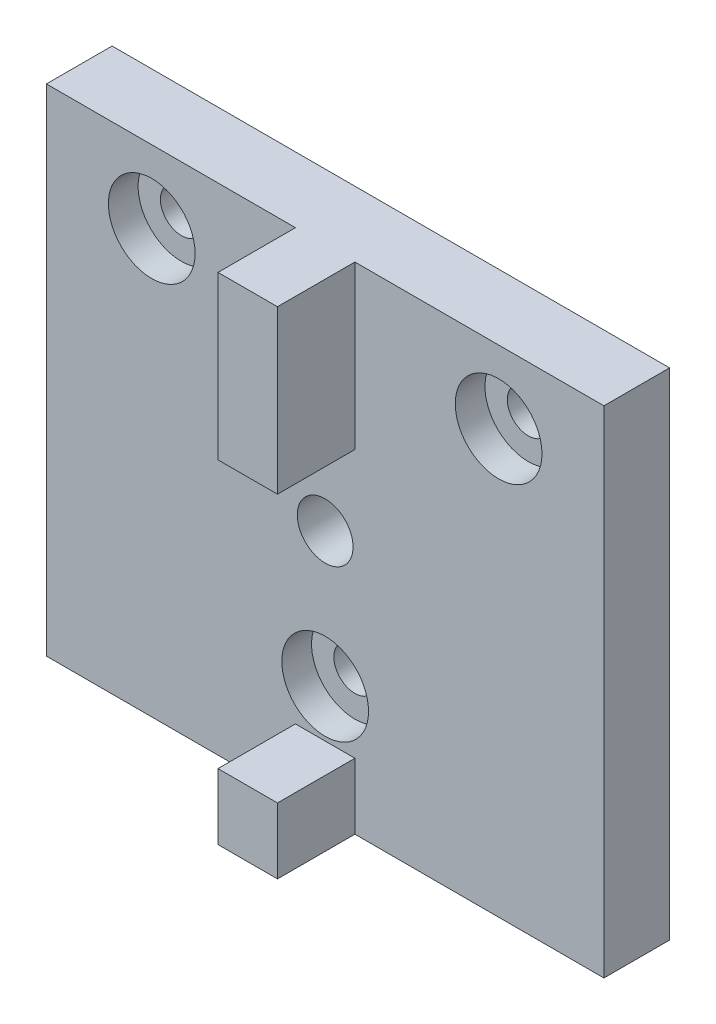
ISO-10303-21;
HEADER;
FILE_DESCRIPTION(('STEP AP214'),'2;1');
FILE_NAME('part.step','',(''),(''),'','','');
FILE_SCHEMA(('AUTOMOTIVE_DESIGN { 1 0 10303 214 1 1 1 1 }'));
ENDSEC;
DATA;
#1=APPLICATION_CONTEXT('core data for automotive mechanical design processes');
#2=APPLICATION_PROTOCOL_DEFINITION('international standard','automotive_design',2000,#1);
#3=PRODUCT_CONTEXT('',#1,'mechanical');
#4=PRODUCT('Part','Part','',(#3));
#5=PRODUCT_RELATED_PRODUCT_CATEGORY('part','',(#4));
#6=PRODUCT_DEFINITION_FORMATION('','',#4);
#7=PRODUCT_DEFINITION_CONTEXT('part definition',#1,'design');
#8=PRODUCT_DEFINITION('design','',#6,#7);
#9=PRODUCT_DEFINITION_SHAPE('','',#8);
#10=(LENGTH_UNIT() NAMED_UNIT(*) SI_UNIT(.MILLI.,.METRE.));
#11=(NAMED_UNIT(*) PLANE_ANGLE_UNIT() SI_UNIT($,.RADIAN.));
#12=(NAMED_UNIT(*) SI_UNIT($,.STERADIAN.) SOLID_ANGLE_UNIT());
#13=UNCERTAINTY_MEASURE_WITH_UNIT(LENGTH_MEASURE(1.E-05),#10,'distance_accuracy_value','');
#14=(GEOMETRIC_REPRESENTATION_CONTEXT(3) GLOBAL_UNCERTAINTY_ASSIGNED_CONTEXT((#13)) GLOBAL_UNIT_ASSIGNED_CONTEXT((#10,
#11,#12)) REPRESENTATION_CONTEXT('',''));
#15=CARTESIAN_POINT('',(0.,0.,0.));
#16=DIRECTION('',(0.,0.,1.));
#17=DIRECTION('',(1.,0.,0.));
#18=AXIS2_PLACEMENT_3D('',#15,#16,#17);
#19=CARTESIAN_POINT('',(3.,20.,-10.0617308618267));
#20=DIRECTION('',(0.,0.,-1.));
#21=DIRECTION('',(-1.,0.,0.));
#22=AXIS2_PLACEMENT_3D('',#19,#20,#21);
#23=PLANE('',#22);
#24=CARTESIAN_POINT('',(0.,0.,-10.0617308618267));
#25=DIRECTION('',(0.,0.,-1.));
#26=DIRECTION('',(-1.,0.,0.));
#27=AXIS2_PLACEMENT_3D('',#24,#25,#26);
#28=CIRCLE('',#27,2.24999999999999);
#29=CARTESIAN_POINT('',(-2.24999999999999,0.,-10.0617308618267));
#30=VERTEX_POINT('',#29);
#31=EDGE_CURVE('E253',#30,#30,#28,.T.);
#32=ORIENTED_EDGE('',*,*,#31,.T.);
#33=EDGE_LOOP('',(#32));
#34=FACE_BOUND('',#33,.T.);
#35=DIRECTION('',(1.,0.,0.));
#36=VECTOR('',#35,1.);
#37=CARTESIAN_POINT('',(3.,-20.,-10.0617308618267));
#38=LINE('',#37,#36);
#39=CARTESIAN_POINT('',(2.4,-20.,-10.0617308618267));
#40=VERTEX_POINT('',#39);
#41=CARTESIAN_POINT('',(22.5,-20.,-10.0617308618267));
#42=VERTEX_POINT('',#41);
#43=EDGE_CURVE('E87',#40,#42,#38,.T.);
#44=ORIENTED_EDGE('',*,*,#43,.T.);
#45=DIRECTION('',(0.,-1.,0.));
#46=VECTOR('',#45,1.);
#47=CARTESIAN_POINT('',(22.5,20.,-10.0617308618267));
#48=LINE('',#47,#46);
#49=CARTESIAN_POINT('',(22.5,20.,-10.0617308618267));
#50=VERTEX_POINT('',#49);
#51=EDGE_CURVE('E139',#50,#42,#48,.T.);
#52=ORIENTED_EDGE('',*,*,#51,.F.);
#53=DIRECTION('',(1.,0.,0.));
#54=VECTOR('',#53,1.);
#55=CARTESIAN_POINT('',(3.,20.,-10.0617308618267));
#56=LINE('',#55,#54);
#57=CARTESIAN_POINT('',(2.4,20.,-10.0617308618267));
#58=VERTEX_POINT('',#57);
#59=EDGE_CURVE('E57',#58,#50,#56,.T.);
#60=ORIENTED_EDGE('',*,*,#59,.F.);
#61=DIRECTION('',(0.,-1.,0.));
#62=VECTOR('',#61,1.);
#63=CARTESIAN_POINT('',(2.4,20.,-10.0617308618267));
#64=LINE('',#63,#62);
#65=CARTESIAN_POINT('',(2.4,6.89401767699028,-10.0617308618267));
#66=VERTEX_POINT('',#65);
#67=EDGE_CURVE('E137',#58,#66,#64,.T.);
#68=ORIENTED_EDGE('',*,*,#67,.T.);
#69=DIRECTION('',(-1.,0.,0.));
#70=VECTOR('',#69,1.);
#71=CARTESIAN_POINT('',(-2.40000000000006,6.89401767699028,-10.0617308618267));
#72=LINE('',#71,#70);
#73=CARTESIAN_POINT('',(-2.4,6.89401767699028,-10.0617308618267));
#74=VERTEX_POINT('',#73);
#75=EDGE_CURVE('E208',#66,#74,#72,.T.);
#76=ORIENTED_EDGE('',*,*,#75,.T.);
#77=DIRECTION('',(0.,-1.,0.));
#78=VECTOR('',#77,1.);
#79=CARTESIAN_POINT('',(-2.4,20.,-10.0617308618267));
#80=LINE('',#79,#78);
#81=CARTESIAN_POINT('',(-2.4,20.,-10.0617308618267));
#82=VERTEX_POINT('',#81);
#83=EDGE_CURVE('E172',#82,#74,#80,.T.);
#84=ORIENTED_EDGE('',*,*,#83,.F.);
#85=DIRECTION('',(1.,0.,0.));
#86=VECTOR('',#85,1.);
#87=CARTESIAN_POINT('',(-22.5,20.,-10.0617308618267));
#88=LINE('',#87,#86);
#89=CARTESIAN_POINT('',(-22.5,20.,-10.0617308618267));
#90=VERTEX_POINT('',#89);
#91=EDGE_CURVE('E192',#90,#82,#88,.T.);
#92=ORIENTED_EDGE('',*,*,#91,.F.);
#93=DIRECTION('',(0.,-1.,0.));
#94=VECTOR('',#93,1.);
#95=CARTESIAN_POINT('',(-22.5,20.,-10.0617308618267));
#96=LINE('',#95,#94);
#97=CARTESIAN_POINT('',(-22.5,-20.,-10.0617308618267));
#98=VERTEX_POINT('',#97);
#99=EDGE_CURVE('E175',#90,#98,#96,.T.);
#100=ORIENTED_EDGE('',*,*,#99,.T.);
#101=DIRECTION('',(1.,0.,0.));
#102=VECTOR('',#101,1.);
#103=CARTESIAN_POINT('',(-3.,-20.,-10.0617308618267));
#104=LINE('',#103,#102);
#105=CARTESIAN_POINT('',(-2.4,-20.,-10.0617308618267));
#106=VERTEX_POINT('',#105);
#107=EDGE_CURVE('E152',#98,#106,#104,.T.);
#108=ORIENTED_EDGE('',*,*,#107,.T.);
#109=CARTESIAN_POINT('',(-2.4,-14.6872550509792,-10.0617308618267));
#110=VERTEX_POINT('',#109);
#111=EDGE_CURVE('E171',#110,#106,#80,.T.);
#112=ORIENTED_EDGE('',*,*,#111,.F.);
#113=DIRECTION('',(1.,0.,0.));
#114=VECTOR('',#113,1.);
#115=CARTESIAN_POINT('',(-2.40000000000006,-14.6872550509792,-10.0617308618267));
#116=LINE('',#115,#114);
#117=CARTESIAN_POINT('',(2.4,-14.6872550509792,-10.0617308618267));
#118=VERTEX_POINT('',#117);
#119=EDGE_CURVE('E48',#110,#118,#116,.T.);
#120=ORIENTED_EDGE('',*,*,#119,.T.);
#121=EDGE_CURVE('E167',#118,#40,#64,.T.);
#122=ORIENTED_EDGE('',*,*,#121,.T.);
#123=EDGE_LOOP('',(#44,#52,#60,#68,#76,#84,#92,#100,#108,#112,#120,#122));
#124=FACE_BOUND('',#123,.T.);
#125=CARTESIAN_POINT('',(0.,-10.8577265835655,-10.0617308618267));
#126=DIRECTION('',(0.,0.,1.));
#127=DIRECTION('',(1.,0.,0.));
#128=AXIS2_PLACEMENT_3D('',#125,#126,#127);
#129=CIRCLE('',#128,3.5);
#130=CARTESIAN_POINT('',(3.5,-10.8577265835655,-10.0617308618267));
#131=VERTEX_POINT('',#130);
#132=EDGE_CURVE('E226',#131,#131,#129,.T.);
#133=ORIENTED_EDGE('',*,*,#132,.F.);
#134=EDGE_LOOP('',(#133));
#135=FACE_BOUND('',#134,.T.);
#136=CARTESIAN_POINT('',(14.,14.1422734164345,-10.0617308618267));
#137=DIRECTION('',(0.,0.,1.));
#138=DIRECTION('',(1.,0.,0.));
#139=AXIS2_PLACEMENT_3D('',#136,#137,#138);
#140=CIRCLE('',#139,3.5);
#141=CARTESIAN_POINT('',(17.5,14.1422734164345,-10.0617308618267));
#142=VERTEX_POINT('',#141);
#143=EDGE_CURVE('E238',#142,#142,#140,.T.);
#144=ORIENTED_EDGE('',*,*,#143,.F.);
#145=EDGE_LOOP('',(#144));
#146=FACE_BOUND('',#145,.T.);
#147=CARTESIAN_POINT('',(-14.,14.1422734164345,-10.0617308618267));
#148=DIRECTION('',(0.,0.,1.));
#149=DIRECTION('',(1.,0.,0.));
#150=AXIS2_PLACEMENT_3D('',#147,#148,#149);
#151=CIRCLE('',#150,3.5);
#152=CARTESIAN_POINT('',(-10.5,14.1422734164345,-10.0617308618267));
#153=VERTEX_POINT('',#152);
#154=EDGE_CURVE('E250',#153,#153,#151,.T.);
#155=ORIENTED_EDGE('',*,*,#154,.F.);
#156=EDGE_LOOP('',(#155));
#157=FACE_BOUND('',#156,.T.);
#158=ADVANCED_FACE('F33',(#34,#124,#135,#146,#157),#23,.F.);
#159=CARTESIAN_POINT('',(-2.4,20.,-10.0617308618267));
#160=DIRECTION('',(1.,0.,0.));
#161=DIRECTION('',(0.,0.,-1.));
#162=AXIS2_PLACEMENT_3D('',#159,#160,#161);
#163=PLANE('',#162);
#164=DIRECTION('',(0.,-1.,0.));
#165=VECTOR('',#164,1.);
#166=CARTESIAN_POINT('',(-2.4,20.,-3.81173086182672));
#167=LINE('',#166,#165);
#168=CARTESIAN_POINT('',(-2.4,-14.6872550509792,-3.81173086182672));
#169=VERTEX_POINT('',#168);
#170=CARTESIAN_POINT('',(-2.4,-20.,-3.81173086182672));
#171=VERTEX_POINT('',#170);
#172=EDGE_CURVE('E132',#169,#171,#167,.T.);
#173=ORIENTED_EDGE('',*,*,#172,.F.);
#174=DIRECTION('',(0.,0.,1.));
#175=VECTOR('',#174,1.);
#176=CARTESIAN_POINT('',(-2.4,-14.6872550509792,-32.1703566119496));
#177=LINE('',#176,#175);
#178=EDGE_CURVE('E147',#110,#169,#177,.T.);
#179=ORIENTED_EDGE('',*,*,#178,.F.);
#180=ORIENTED_EDGE('',*,*,#111,.T.);
#181=DIRECTION('',(0.,0.,1.));
#182=VECTOR('',#181,1.);
#183=CARTESIAN_POINT('',(-2.4,-20.,-10.0617308618267));
#184=LINE('',#183,#182);
#185=EDGE_CURVE('E155',#106,#171,#184,.T.);
#186=ORIENTED_EDGE('',*,*,#185,.T.);
#187=EDGE_LOOP('',(#173,#179,#180,#186));
#188=FACE_BOUND('',#187,.T.);
#189=ADVANCED_FACE('F285',(#188),#163,.F.);
#190=CARTESIAN_POINT('',(-2.4,20.,-3.81173086182672));
#191=DIRECTION('',(0.,0.,-1.));
#192=DIRECTION('',(-1.,0.,0.));
#193=AXIS2_PLACEMENT_3D('',#190,#191,#192);
#194=PLANE('',#193);
#195=DIRECTION('',(0.,-1.,0.));
#196=VECTOR('',#195,1.);
#197=CARTESIAN_POINT('',(2.4,20.,-3.81173086182672));
#198=LINE('',#197,#196);
#199=CARTESIAN_POINT('',(2.4,-14.6872550509792,-3.81173086182672));
#200=VERTEX_POINT('',#199);
#201=CARTESIAN_POINT('',(2.4,-20.,-3.81173086182672));
#202=VERTEX_POINT('',#201);
#203=EDGE_CURVE('E133',#200,#202,#198,.T.);
#204=ORIENTED_EDGE('',*,*,#203,.F.);
#205=DIRECTION('',(1.,0.,0.));
#206=VECTOR('',#205,1.);
#207=CARTESIAN_POINT('',(-2.4,-14.6872550509792,-3.81173086182672));
#208=LINE('',#207,#206);
#209=EDGE_CURVE('E213',#169,#200,#208,.T.);
#210=ORIENTED_EDGE('',*,*,#209,.F.);
#211=ORIENTED_EDGE('',*,*,#172,.T.);
#212=DIRECTION('',(1.,0.,0.));
#213=VECTOR('',#212,1.);
#214=CARTESIAN_POINT('',(-2.4,-20.,-3.81173086182672));
#215=LINE('',#214,#213);
#216=EDGE_CURVE('E158',#171,#202,#215,.T.);
#217=ORIENTED_EDGE('',*,*,#216,.T.);
#218=EDGE_LOOP('',(#204,#210,#211,#217));
#219=FACE_BOUND('',#218,.T.);
#220=ADVANCED_FACE('F281',(#219),#194,.F.);
#221=CARTESIAN_POINT('',(2.4,20.,-10.0617308618267));
#222=DIRECTION('',(-1.,0.,0.));
#223=DIRECTION('',(0.,0.,1.));
#224=AXIS2_PLACEMENT_3D('',#221,#222,#223);
#225=PLANE('',#224);
#226=ORIENTED_EDGE('',*,*,#121,.F.);
#227=DIRECTION('',(0.,0.,1.));
#228=VECTOR('',#227,1.);
#229=CARTESIAN_POINT('',(2.4,-14.6872550509792,-32.1703566119496));
#230=LINE('',#229,#228);
#231=EDGE_CURVE('E202',#118,#200,#230,.T.);
#232=ORIENTED_EDGE('',*,*,#231,.T.);
#233=ORIENTED_EDGE('',*,*,#203,.T.);
#234=DIRECTION('',(0.,0.,-1.));
#235=VECTOR('',#234,1.);
#236=CARTESIAN_POINT('',(2.4,-20.,-10.0617308618267));
#237=LINE('',#236,#235);
#238=EDGE_CURVE('E161',#202,#40,#237,.T.);
#239=ORIENTED_EDGE('',*,*,#238,.T.);
#240=EDGE_LOOP('',(#226,#232,#233,#239));
#241=FACE_BOUND('',#240,.T.);
#242=ADVANCED_FACE('F276',(#241),#225,.F.);
#243=CARTESIAN_POINT('',(22.5,20.,-10.0617308618267));
#244=DIRECTION('',(-1.,0.,0.));
#245=DIRECTION('',(0.,0.,1.));
#246=AXIS2_PLACEMENT_3D('',#243,#244,#245);
#247=PLANE('',#246);
#248=DIRECTION('',(0.,0.,-1.));
#249=VECTOR('',#248,1.);
#250=CARTESIAN_POINT('',(22.5,-20.,-10.0617308618267));
#251=LINE('',#250,#249);
#252=CARTESIAN_POINT('',(22.5,-20.,-15.3617308618267));
#253=VERTEX_POINT('',#252);
#254=EDGE_CURVE('E143',#42,#253,#251,.T.);
#255=ORIENTED_EDGE('',*,*,#254,.T.);
#256=DIRECTION('',(0.,-1.,0.));
#257=VECTOR('',#256,1.);
#258=CARTESIAN_POINT('',(22.5,20.,-15.3617308618267));
#259=LINE('',#258,#257);
#260=CARTESIAN_POINT('',(22.5,20.,-15.3617308618267));
#261=VERTEX_POINT('',#260);
#262=EDGE_CURVE('E11',#261,#253,#259,.T.);
#263=ORIENTED_EDGE('',*,*,#262,.F.);
#264=DIRECTION('',(0.,0.,-1.));
#265=VECTOR('',#264,1.);
#266=CARTESIAN_POINT('',(22.5,20.,-10.0617308618267));
#267=LINE('',#266,#265);
#268=EDGE_CURVE('E165',#50,#261,#267,.T.);
#269=ORIENTED_EDGE('',*,*,#268,.F.);
#270=ORIENTED_EDGE('',*,*,#51,.T.);
#271=EDGE_LOOP('',(#255,#263,#269,#270));
#272=FACE_BOUND('',#271,.T.);
#273=ADVANCED_FACE('F35',(#272),#247,.F.);
#274=CARTESIAN_POINT('',(-22.5,20.,-15.3617308618267));
#275=DIRECTION('',(0.,0.,1.));
#276=DIRECTION('',(1.,0.,0.));
#277=AXIS2_PLACEMENT_3D('',#274,#275,#276);
#278=PLANE('',#277);
#279=CARTESIAN_POINT('',(0.,0.,-15.3617308618267));
#280=DIRECTION('',(0.,0.,-1.));
#281=DIRECTION('',(-1.,0.,0.));
#282=AXIS2_PLACEMENT_3D('',#279,#280,#281);
#283=CIRCLE('',#282,2.24999999999999);
#284=CARTESIAN_POINT('',(-2.24999999999999,0.,-15.3617308618267));
#285=VERTEX_POINT('',#284);
#286=EDGE_CURVE('E256',#285,#285,#283,.T.);
#287=ORIENTED_EDGE('',*,*,#286,.F.);
#288=EDGE_LOOP('',(#287));
#289=FACE_BOUND('',#288,.T.);
#290=CARTESIAN_POINT('',(-14.,14.1422734164345,-15.3617308618267));
#291=DIRECTION('',(0.,0.,1.));
#292=DIRECTION('',(1.,0.,0.));
#293=AXIS2_PLACEMENT_3D('',#290,#291,#292);
#294=CIRCLE('',#293,1.7);
#295=CARTESIAN_POINT('',(-12.3,14.1422734164345,-15.3617308618267));
#296=VERTEX_POINT('',#295);
#297=EDGE_CURVE('E241',#296,#296,#294,.T.);
#298=ORIENTED_EDGE('',*,*,#297,.T.);
#299=EDGE_LOOP('',(#298));
#300=FACE_BOUND('',#299,.T.);
#301=CARTESIAN_POINT('',(14.,14.1422734164345,-15.3617308618267));
#302=DIRECTION('',(0.,0.,1.));
#303=DIRECTION('',(1.,0.,0.));
#304=AXIS2_PLACEMENT_3D('',#301,#302,#303);
#305=CIRCLE('',#304,1.7);
#306=CARTESIAN_POINT('',(15.7,14.1422734164345,-15.3617308618267));
#307=VERTEX_POINT('',#306);
#308=EDGE_CURVE('E229',#307,#307,#305,.T.);
#309=ORIENTED_EDGE('',*,*,#308,.T.);
#310=EDGE_LOOP('',(#309));
#311=FACE_BOUND('',#310,.T.);
#312=CARTESIAN_POINT('',(0.,-10.8577265835655,-15.3617308618267));
#313=DIRECTION('',(0.,0.,1.));
#314=DIRECTION('',(1.,0.,0.));
#315=AXIS2_PLACEMENT_3D('',#312,#313,#314);
#316=CIRCLE('',#315,1.7);
#317=CARTESIAN_POINT('',(1.7,-10.8577265835655,-15.3617308618267));
#318=VERTEX_POINT('',#317);
#319=EDGE_CURVE('E216',#318,#318,#316,.T.);
#320=ORIENTED_EDGE('',*,*,#319,.T.);
#321=EDGE_LOOP('',(#320));
#322=FACE_BOUND('',#321,.T.);
#323=DIRECTION('',(-1.,0.,0.));
#324=VECTOR('',#323,1.);
#325=CARTESIAN_POINT('',(-22.5,-20.,-15.3617308618267));
#326=LINE('',#325,#324);
#327=CARTESIAN_POINT('',(-22.5,-20.,-15.3617308618267));
#328=VERTEX_POINT('',#327);
#329=EDGE_CURVE('E146',#253,#328,#326,.T.);
#330=ORIENTED_EDGE('',*,*,#329,.T.);
#331=DIRECTION('',(0.,-1.,0.));
#332=VECTOR('',#331,1.);
#333=CARTESIAN_POINT('',(-22.5,20.,-15.3617308618267));
#334=LINE('',#333,#332);
#335=CARTESIAN_POINT('',(-22.5,20.,-15.3617308618267));
#336=VERTEX_POINT('',#335);
#337=EDGE_CURVE('E41',#336,#328,#334,.T.);
#338=ORIENTED_EDGE('',*,*,#337,.F.);
#339=DIRECTION('',(-1.,0.,0.));
#340=VECTOR('',#339,1.);
#341=CARTESIAN_POINT('',(-22.5,20.,-15.3617308618267));
#342=LINE('',#341,#340);
#343=EDGE_CURVE('E95',#261,#336,#342,.T.);
#344=ORIENTED_EDGE('',*,*,#343,.F.);
#345=ORIENTED_EDGE('',*,*,#262,.T.);
#346=EDGE_LOOP('',(#330,#338,#344,#345));
#347=FACE_BOUND('',#346,.T.);
#348=ADVANCED_FACE('F262',(#289,#300,#311,#322,#347),#278,.F.);
#349=CARTESIAN_POINT('',(-22.5,20.,-15.3617308618267));
#350=DIRECTION('',(1.,0.,0.));
#351=DIRECTION('',(0.,0.,-1.));
#352=AXIS2_PLACEMENT_3D('',#349,#350,#351);
#353=PLANE('',#352);
#354=DIRECTION('',(0.,0.,1.));
#355=VECTOR('',#354,1.);
#356=CARTESIAN_POINT('',(-22.5,-20.,-15.3617308618267));
#357=LINE('',#356,#355);
#358=EDGE_CURVE('E149',#328,#98,#357,.T.);
#359=ORIENTED_EDGE('',*,*,#358,.T.);
#360=ORIENTED_EDGE('',*,*,#99,.F.);
#361=DIRECTION('',(0.,0.,1.));
#362=VECTOR('',#361,1.);
#363=CARTESIAN_POINT('',(-22.5,20.,-15.3617308618267));
#364=LINE('',#363,#362);
#365=EDGE_CURVE('E183',#336,#90,#364,.T.);
#366=ORIENTED_EDGE('',*,*,#365,.F.);
#367=ORIENTED_EDGE('',*,*,#337,.T.);
#368=EDGE_LOOP('',(#359,#360,#366,#367));
#369=FACE_BOUND('',#368,.T.);
#370=ADVANCED_FACE('F181',(#369),#353,.F.);
#371=ORIENTED_EDGE('',*,*,#83,.T.);
#372=DIRECTION('',(0.,0.,1.));
#373=VECTOR('',#372,1.);
#374=CARTESIAN_POINT('',(-2.4,6.89401767699028,-32.1703566119496));
#375=LINE('',#374,#373);
#376=CARTESIAN_POINT('',(-2.4,6.89401767699028,-3.81173086182672));
#377=VERTEX_POINT('',#376);
#378=EDGE_CURVE('E201',#74,#377,#375,.T.);
#379=ORIENTED_EDGE('',*,*,#378,.T.);
#380=CARTESIAN_POINT('',(-2.4,20.,-3.81173086182672));
#381=VERTEX_POINT('',#380);
#382=EDGE_CURVE('E169',#381,#377,#167,.T.);
#383=ORIENTED_EDGE('',*,*,#382,.F.);
#384=DIRECTION('',(0.,0.,1.));
#385=VECTOR('',#384,1.);
#386=CARTESIAN_POINT('',(-2.4,20.,-10.0617308618267));
#387=LINE('',#386,#385);
#388=EDGE_CURVE('E118',#82,#381,#387,.T.);
#389=ORIENTED_EDGE('',*,*,#388,.F.);
#390=EDGE_LOOP('',(#371,#379,#383,#389));
#391=FACE_BOUND('',#390,.T.);
#392=ADVANCED_FACE('F301',(#391),#163,.F.);
#393=ORIENTED_EDGE('',*,*,#382,.T.);
#394=DIRECTION('',(-1.,0.,0.));
#395=VECTOR('',#394,1.);
#396=CARTESIAN_POINT('',(-2.4,6.89401767699028,-3.81173086182672));
#397=LINE('',#396,#395);
#398=CARTESIAN_POINT('',(2.4,6.89401767699028,-3.81173086182672));
#399=VERTEX_POINT('',#398);
#400=EDGE_CURVE('E129',#399,#377,#397,.T.);
#401=ORIENTED_EDGE('',*,*,#400,.F.);
#402=CARTESIAN_POINT('',(2.4,20.,-3.81173086182672));
#403=VERTEX_POINT('',#402);
#404=EDGE_CURVE('E125',#403,#399,#198,.T.);
#405=ORIENTED_EDGE('',*,*,#404,.F.);
#406=DIRECTION('',(1.,0.,0.));
#407=VECTOR('',#406,1.);
#408=CARTESIAN_POINT('',(-2.4,20.,-3.81173086182672));
#409=LINE('',#408,#407);
#410=EDGE_CURVE('E111',#381,#403,#409,.T.);
#411=ORIENTED_EDGE('',*,*,#410,.F.);
#412=EDGE_LOOP('',(#393,#401,#405,#411));
#413=FACE_BOUND('',#412,.T.);
#414=ADVANCED_FACE('F126',(#413),#194,.F.);
#415=ORIENTED_EDGE('',*,*,#404,.T.);
#416=DIRECTION('',(0.,0.,1.));
#417=VECTOR('',#416,1.);
#418=CARTESIAN_POINT('',(2.4,6.89401767699028,-32.1703566119496));
#419=LINE('',#418,#417);
#420=EDGE_CURVE('E205',#66,#399,#419,.T.);
#421=ORIENTED_EDGE('',*,*,#420,.F.);
#422=ORIENTED_EDGE('',*,*,#67,.F.);
#423=DIRECTION('',(0.,0.,-1.));
#424=VECTOR('',#423,1.);
#425=CARTESIAN_POINT('',(2.4,20.,-10.0617308618267));
#426=LINE('',#425,#424);
#427=EDGE_CURVE('E115',#403,#58,#426,.T.);
#428=ORIENTED_EDGE('',*,*,#427,.F.);
#429=EDGE_LOOP('',(#415,#421,#422,#428));
#430=FACE_BOUND('',#429,.T.);
#431=ADVANCED_FACE('F135',(#430),#225,.F.);
#432=CARTESIAN_POINT('',(0.,20.,0.));
#433=DIRECTION('',(0.,-1.,0.));
#434=DIRECTION('',(0.,0.,-1.));
#435=AXIS2_PLACEMENT_3D('',#432,#433,#434);
#436=PLANE('',#435);
#437=ORIENTED_EDGE('',*,*,#268,.T.);
#438=ORIENTED_EDGE('',*,*,#343,.T.);
#439=ORIENTED_EDGE('',*,*,#365,.T.);
#440=ORIENTED_EDGE('',*,*,#91,.T.);
#441=ORIENTED_EDGE('',*,*,#388,.T.);
#442=ORIENTED_EDGE('',*,*,#410,.T.);
#443=ORIENTED_EDGE('',*,*,#427,.T.);
#444=ORIENTED_EDGE('',*,*,#59,.T.);
#445=EDGE_LOOP('',(#437,#438,#439,#440,#441,#442,#443,#444));
#446=FACE_BOUND('',#445,.T.);
#447=ADVANCED_FACE('F113',(#446),#436,.F.);
#448=CARTESIAN_POINT('',(0.,-20.,0.));
#449=DIRECTION('',(0.,-1.,0.));
#450=DIRECTION('',(0.,0.,-1.));
#451=AXIS2_PLACEMENT_3D('',#448,#449,#450);
#452=PLANE('',#451);
#453=ORIENTED_EDGE('',*,*,#254,.F.);
#454=ORIENTED_EDGE('',*,*,#43,.F.);
#455=ORIENTED_EDGE('',*,*,#238,.F.);
#456=ORIENTED_EDGE('',*,*,#216,.F.);
#457=ORIENTED_EDGE('',*,*,#185,.F.);
#458=ORIENTED_EDGE('',*,*,#107,.F.);
#459=ORIENTED_EDGE('',*,*,#358,.F.);
#460=ORIENTED_EDGE('',*,*,#329,.F.);
#461=EDGE_LOOP('',(#453,#454,#455,#456,#457,#458,#459,#460));
#462=FACE_BOUND('',#461,.T.);
#463=ADVANCED_FACE('F186',(#462),#452,.T.);
#464=CARTESIAN_POINT('',(-2.4,-14.6872550509792,-32.1703566119496));
#465=DIRECTION('',(0.,-1.,0.));
#466=DIRECTION('',(1.,0.,0.));
#467=AXIS2_PLACEMENT_3D('',#464,#465,#466);
#468=PLANE('',#467);
#469=ORIENTED_EDGE('',*,*,#178,.T.);
#470=ORIENTED_EDGE('',*,*,#209,.T.);
#471=ORIENTED_EDGE('',*,*,#231,.F.);
#472=ORIENTED_EDGE('',*,*,#119,.F.);
#473=EDGE_LOOP('',(#469,#470,#471,#472));
#474=FACE_BOUND('',#473,.T.);
#475=ADVANCED_FACE('F288',(#474),#468,.F.);
#476=CARTESIAN_POINT('',(-2.4,6.89401767699028,-32.1703566119496));
#477=DIRECTION('',(0.,1.,0.));
#478=DIRECTION('',(0.,0.,1.));
#479=AXIS2_PLACEMENT_3D('',#476,#477,#478);
#480=PLANE('',#479);
#481=ORIENTED_EDGE('',*,*,#420,.T.);
#482=ORIENTED_EDGE('',*,*,#400,.T.);
#483=ORIENTED_EDGE('',*,*,#378,.F.);
#484=ORIENTED_EDGE('',*,*,#75,.F.);
#485=EDGE_LOOP('',(#481,#482,#483,#484));
#486=FACE_BOUND('',#485,.T.);
#487=ADVANCED_FACE('F299',(#486),#480,.F.);
#488=CARTESIAN_POINT('',(0.,-10.8577265835655,-10.0617308618267));
#489=DIRECTION('',(0.,0.,1.));
#490=DIRECTION('',(1.,0.,0.));
#491=AXIS2_PLACEMENT_3D('',#488,#489,#490);
#492=CYLINDRICAL_SURFACE('',#491,1.7);
#493=ORIENTED_EDGE('',*,*,#319,.F.);
#494=EDGE_LOOP('',(#493));
#495=FACE_BOUND('',#494,.T.);
#496=CARTESIAN_POINT('',(0.,-10.8577265835655,-12.4617308618267));
#497=DIRECTION('',(0.,0.,1.));
#498=DIRECTION('',(1.,0.,0.));
#499=AXIS2_PLACEMENT_3D('',#496,#497,#498);
#500=CIRCLE('',#499,1.7);
#501=CARTESIAN_POINT('',(1.7,-10.8577265835655,-12.4617308618267));
#502=VERTEX_POINT('',#501);
#503=EDGE_CURVE('E220',#502,#502,#500,.T.);
#504=ORIENTED_EDGE('',*,*,#503,.T.);
#505=EDGE_LOOP('',(#504));
#506=FACE_BOUND('',#505,.T.);
#507=ADVANCED_FACE('F447',(#495,#506),#492,.F.);
#508=CARTESIAN_POINT('',(1.7,-10.8577265835655,-12.4617308618267));
#509=DIRECTION('',(0.,0.,-1.));
#510=DIRECTION('',(-1.,0.,0.));
#511=AXIS2_PLACEMENT_3D('',#508,#509,#510);
#512=PLANE('',#511);
#513=ORIENTED_EDGE('',*,*,#503,.F.);
#514=EDGE_LOOP('',(#513));
#515=FACE_BOUND('',#514,.T.);
#516=CARTESIAN_POINT('',(0.,-10.8577265835655,-12.4617308618267));
#517=DIRECTION('',(0.,0.,1.));
#518=DIRECTION('',(1.,0.,0.));
#519=AXIS2_PLACEMENT_3D('',#516,#517,#518);
#520=CIRCLE('',#519,3.5);
#521=CARTESIAN_POINT('',(3.5,-10.8577265835655,-12.4617308618267));
#522=VERTEX_POINT('',#521);
#523=EDGE_CURVE('E223',#522,#522,#520,.T.);
#524=ORIENTED_EDGE('',*,*,#523,.T.);
#525=EDGE_LOOP('',(#524));
#526=FACE_BOUND('',#525,.T.);
#527=ADVANCED_FACE('F439',(#515,#526),#512,.F.);
#528=CARTESIAN_POINT('',(0.,-10.8577265835655,-10.0617308618267));
#529=DIRECTION('',(0.,0.,1.));
#530=DIRECTION('',(1.,0.,0.));
#531=AXIS2_PLACEMENT_3D('',#528,#529,#530);
#532=CYLINDRICAL_SURFACE('',#531,3.5);
#533=ORIENTED_EDGE('',*,*,#523,.F.);
#534=EDGE_LOOP('',(#533));
#535=FACE_BOUND('',#534,.T.);
#536=ORIENTED_EDGE('',*,*,#132,.T.);
#537=EDGE_LOOP('',(#536));
#538=FACE_BOUND('',#537,.T.);
#539=ADVANCED_FACE('F431',(#535,#538),#532,.F.);
#540=CARTESIAN_POINT('',(14.,14.1422734164345,-10.0617308618267));
#541=DIRECTION('',(0.,0.,1.));
#542=DIRECTION('',(1.,0.,0.));
#543=AXIS2_PLACEMENT_3D('',#540,#541,#542);
#544=CYLINDRICAL_SURFACE('',#543,1.7);
#545=ORIENTED_EDGE('',*,*,#308,.F.);
#546=EDGE_LOOP('',(#545));
#547=FACE_BOUND('',#546,.T.);
#548=CARTESIAN_POINT('',(14.,14.1422734164345,-12.4617308618267));
#549=DIRECTION('',(0.,0.,1.));
#550=DIRECTION('',(1.,0.,0.));
#551=AXIS2_PLACEMENT_3D('',#548,#549,#550);
#552=CIRCLE('',#551,1.7);
#553=CARTESIAN_POINT('',(15.7,14.1422734164345,-12.4617308618267));
#554=VERTEX_POINT('',#553);
#555=EDGE_CURVE('E232',#554,#554,#552,.T.);
#556=ORIENTED_EDGE('',*,*,#555,.T.);
#557=EDGE_LOOP('',(#556));
#558=FACE_BOUND('',#557,.T.);
#559=ADVANCED_FACE('F423',(#547,#558),#544,.F.);
#560=CARTESIAN_POINT('',(15.7,14.1422734164345,-12.4617308618267));
#561=DIRECTION('',(0.,0.,-1.));
#562=DIRECTION('',(-1.,0.,0.));
#563=AXIS2_PLACEMENT_3D('',#560,#561,#562);
#564=PLANE('',#563);
#565=ORIENTED_EDGE('',*,*,#555,.F.);
#566=EDGE_LOOP('',(#565));
#567=FACE_BOUND('',#566,.T.);
#568=CARTESIAN_POINT('',(14.,14.1422734164345,-12.4617308618267));
#569=DIRECTION('',(0.,0.,1.));
#570=DIRECTION('',(1.,0.,0.));
#571=AXIS2_PLACEMENT_3D('',#568,#569,#570);
#572=CIRCLE('',#571,3.5);
#573=CARTESIAN_POINT('',(17.5,14.1422734164345,-12.4617308618267));
#574=VERTEX_POINT('',#573);
#575=EDGE_CURVE('E235',#574,#574,#572,.T.);
#576=ORIENTED_EDGE('',*,*,#575,.T.);
#577=EDGE_LOOP('',(#576));
#578=FACE_BOUND('',#577,.T.);
#579=ADVANCED_FACE('F415',(#567,#578),#564,.F.);
#580=CARTESIAN_POINT('',(14.,14.1422734164345,-10.0617308618267));
#581=DIRECTION('',(0.,0.,1.));
#582=DIRECTION('',(1.,0.,0.));
#583=AXIS2_PLACEMENT_3D('',#580,#581,#582);
#584=CYLINDRICAL_SURFACE('',#583,3.5);
#585=ORIENTED_EDGE('',*,*,#575,.F.);
#586=EDGE_LOOP('',(#585));
#587=FACE_BOUND('',#586,.T.);
#588=ORIENTED_EDGE('',*,*,#143,.T.);
#589=EDGE_LOOP('',(#588));
#590=FACE_BOUND('',#589,.T.);
#591=ADVANCED_FACE('F407',(#587,#590),#584,.F.);
#592=CARTESIAN_POINT('',(-14.,14.1422734164345,-10.0617308618267));
#593=DIRECTION('',(0.,0.,1.));
#594=DIRECTION('',(1.,0.,0.));
#595=AXIS2_PLACEMENT_3D('',#592,#593,#594);
#596=CYLINDRICAL_SURFACE('',#595,1.7);
#597=ORIENTED_EDGE('',*,*,#297,.F.);
#598=EDGE_LOOP('',(#597));
#599=FACE_BOUND('',#598,.T.);
#600=CARTESIAN_POINT('',(-14.,14.1422734164345,-12.4617308618267));
#601=DIRECTION('',(0.,0.,1.));
#602=DIRECTION('',(1.,0.,0.));
#603=AXIS2_PLACEMENT_3D('',#600,#601,#602);
#604=CIRCLE('',#603,1.7);
#605=CARTESIAN_POINT('',(-12.3,14.1422734164345,-12.4617308618267));
#606=VERTEX_POINT('',#605);
#607=EDGE_CURVE('E244',#606,#606,#604,.T.);
#608=ORIENTED_EDGE('',*,*,#607,.T.);
#609=EDGE_LOOP('',(#608));
#610=FACE_BOUND('',#609,.T.);
#611=ADVANCED_FACE('F399',(#599,#610),#596,.F.);
#612=CARTESIAN_POINT('',(-12.3,14.1422734164345,-12.4617308618267));
#613=DIRECTION('',(0.,0.,-1.));
#614=DIRECTION('',(-1.,0.,0.));
#615=AXIS2_PLACEMENT_3D('',#612,#613,#614);
#616=PLANE('',#615);
#617=ORIENTED_EDGE('',*,*,#607,.F.);
#618=EDGE_LOOP('',(#617));
#619=FACE_BOUND('',#618,.T.);
#620=CARTESIAN_POINT('',(-14.,14.1422734164345,-12.4617308618267));
#621=DIRECTION('',(0.,0.,1.));
#622=DIRECTION('',(1.,0.,0.));
#623=AXIS2_PLACEMENT_3D('',#620,#621,#622);
#624=CIRCLE('',#623,3.5);
#625=CARTESIAN_POINT('',(-10.5,14.1422734164345,-12.4617308618267));
#626=VERTEX_POINT('',#625);
#627=EDGE_CURVE('E247',#626,#626,#624,.T.);
#628=ORIENTED_EDGE('',*,*,#627,.T.);
#629=EDGE_LOOP('',(#628));
#630=FACE_BOUND('',#629,.T.);
#631=ADVANCED_FACE('F392',(#619,#630),#616,.F.);
#632=CARTESIAN_POINT('',(-14.,14.1422734164345,-10.0617308618267));
#633=DIRECTION('',(0.,0.,1.));
#634=DIRECTION('',(1.,0.,0.));
#635=AXIS2_PLACEMENT_3D('',#632,#633,#634);
#636=CYLINDRICAL_SURFACE('',#635,3.5);
#637=ORIENTED_EDGE('',*,*,#627,.F.);
#638=EDGE_LOOP('',(#637));
#639=FACE_BOUND('',#638,.T.);
#640=ORIENTED_EDGE('',*,*,#154,.T.);
#641=EDGE_LOOP('',(#640));
#642=FACE_BOUND('',#641,.T.);
#643=ADVANCED_FACE('F382',(#639,#642),#636,.F.);
#644=CARTESIAN_POINT('',(0.,0.,-15.3617308618267));
#645=DIRECTION('',(0.,0.,-1.));
#646=DIRECTION('',(-1.,0.,0.));
#647=AXIS2_PLACEMENT_3D('',#644,#645,#646);
#648=CYLINDRICAL_SURFACE('',#647,2.24999999999999);
#649=ORIENTED_EDGE('',*,*,#31,.F.);
#650=EDGE_LOOP('',(#649));
#651=FACE_BOUND('',#650,.T.);
#652=ORIENTED_EDGE('',*,*,#286,.T.);
#653=EDGE_LOOP('',(#652));
#654=FACE_BOUND('',#653,.T.);
#655=ADVANCED_FACE('F260',(#651,#654),#648,.F.);
#656=CLOSED_SHELL('',(#158,#189,#220,#242,#273,#348,#370,#392,#414,#431,#447,#463,#475,#487,
#507,#527,#539,#559,#579,#591,#611,#631,#643,#655));
#657=MANIFOLD_SOLID_BREP('B2',#656);
#658=ADVANCED_BREP_SHAPE_REPRESENTATION('',(#18,#657),#14);
#659=SHAPE_DEFINITION_REPRESENTATION(#9,#658);
ENDSEC;
END-ISO-10303-21;
